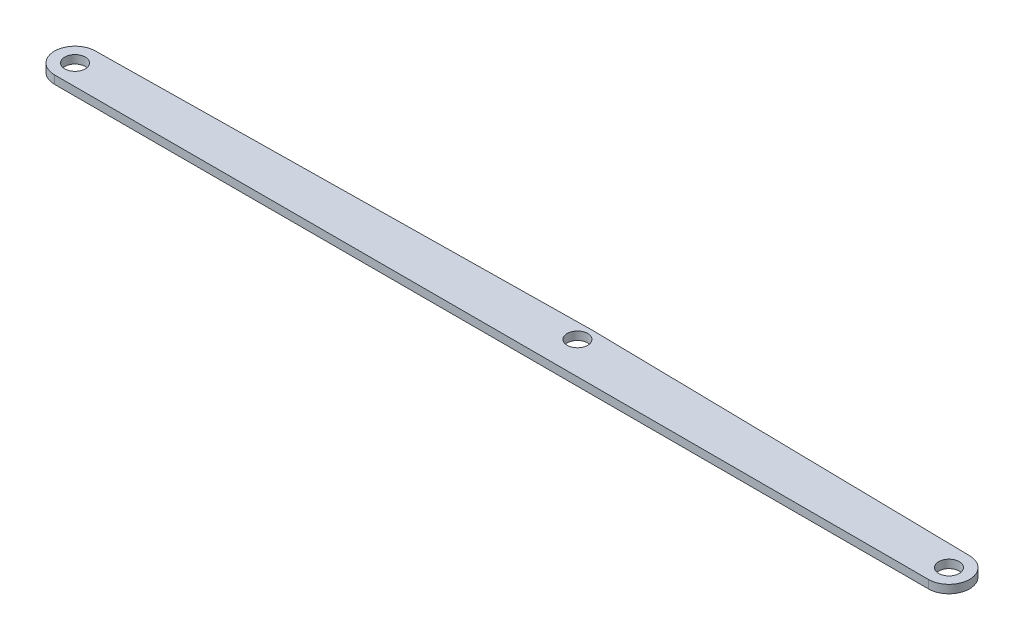
ISO-10303-21;
HEADER;
FILE_DESCRIPTION(('STEP AP214'),'2;1');
FILE_NAME('part.step','',(''),(''),'','','');
FILE_SCHEMA(('AUTOMOTIVE_DESIGN { 1 0 10303 214 1 1 1 1 }'));
ENDSEC;
DATA;
#1=APPLICATION_CONTEXT('core data for automotive mechanical design processes');
#2=APPLICATION_PROTOCOL_DEFINITION('international standard','automotive_design',2000,#1);
#3=PRODUCT_CONTEXT('',#1,'mechanical');
#4=PRODUCT('Part','Part','',(#3));
#5=PRODUCT_RELATED_PRODUCT_CATEGORY('part','',(#4));
#6=PRODUCT_DEFINITION_FORMATION('','',#4);
#7=PRODUCT_DEFINITION_CONTEXT('part definition',#1,'design');
#8=PRODUCT_DEFINITION('design','',#6,#7);
#9=PRODUCT_DEFINITION_SHAPE('','',#8);
#10=(LENGTH_UNIT() NAMED_UNIT(*) SI_UNIT(.MILLI.,.METRE.));
#11=(NAMED_UNIT(*) PLANE_ANGLE_UNIT() SI_UNIT($,.RADIAN.));
#12=(NAMED_UNIT(*) SI_UNIT($,.STERADIAN.) SOLID_ANGLE_UNIT());
#13=UNCERTAINTY_MEASURE_WITH_UNIT(LENGTH_MEASURE(1.E-05),#10,'distance_accuracy_value','');
#14=(GEOMETRIC_REPRESENTATION_CONTEXT(3) GLOBAL_UNCERTAINTY_ASSIGNED_CONTEXT((#13)) GLOBAL_UNIT_ASSIGNED_CONTEXT((#10,
#11,#12)) REPRESENTATION_CONTEXT('',''));
#15=CARTESIAN_POINT('',(0.,0.,0.));
#16=DIRECTION('',(0.,0.,1.));
#17=DIRECTION('',(1.,0.,0.));
#18=AXIS2_PLACEMENT_3D('',#15,#16,#17);
#19=CARTESIAN_POINT('',(0.,5.08,0.));
#20=DIRECTION('',(0.,-1.,0.));
#21=DIRECTION('',(0.,0.,-1.));
#22=AXIS2_PLACEMENT_3D('',#19,#20,#21);
#23=PLANE('',#22);
#24=CARTESIAN_POINT('',(0.,5.08,0.));
#25=DIRECTION('',(0.,1.,0.));
#26=DIRECTION('',(0.,0.,-1.));
#27=AXIS2_PLACEMENT_3D('',#24,#25,#26);
#28=CIRCLE('',#27,12.7);
#29=CARTESIAN_POINT('',(0.,5.08,12.7));
#30=VERTEX_POINT('',#29);
#31=CARTESIAN_POINT('',(0.,5.08,-12.7));
#32=VERTEX_POINT('',#31);
#33=EDGE_CURVE('E139',#30,#32,#28,.T.);
#34=ORIENTED_EDGE('',*,*,#33,.T.);
#35=DIRECTION('',(-0.999848752882836,0.,-0.017391703730135));
#36=VECTOR('',#35,1.);
#37=CARTESIAN_POINT('',(0.,5.08,-12.7));
#38=LINE('',#37,#36);
#39=CARTESIAN_POINT('',(-236.622080232382,5.08,-16.8158836309436));
#40=VERTEX_POINT('',#39);
#41=EDGE_CURVE('E97',#32,#40,#38,.T.);
#42=ORIENTED_EDGE('',*,*,#41,.T.);
#43=CARTESIAN_POINT('',(-236.787736210412,5.08,-7.29232425973456));
#44=DIRECTION('',(0.,1.,0.));
#45=DIRECTION('',(0.,0.,1.));
#46=AXIS2_PLACEMENT_3D('',#43,#44,#45);
#47=CIRCLE('',#46,9.525);
#48=CARTESIAN_POINT('',(-236.917177406981,5.08,-16.8164446903376));
#49=VERTEX_POINT('',#48);
#50=EDGE_CURVE('E110',#40,#49,#47,.T.);
#51=ORIENTED_EDGE('',*,*,#50,.T.);
#52=DIRECTION('',(-0.999907656756227,0.,0.0135896269363969));
#53=VECTOR('',#52,1.);
#54=CARTESIAN_POINT('',(-539.8,5.08,-12.7000000000001));
#55=LINE('',#54,#53);
#56=CARTESIAN_POINT('',(-539.8,5.08,-12.7000000000001));
#57=VERTEX_POINT('',#56);
#58=EDGE_CURVE('E104',#49,#57,#55,.T.);
#59=ORIENTED_EDGE('',*,*,#58,.T.);
#60=CARTESIAN_POINT('',(-539.8,5.08,0.));
#61=DIRECTION('',(0.,1.,0.));
#62=DIRECTION('',(0.,0.,-1.));
#63=AXIS2_PLACEMENT_3D('',#60,#61,#62);
#64=CIRCLE('',#63,12.7);
#65=CARTESIAN_POINT('',(-539.8,5.08,12.7));
#66=VERTEX_POINT('',#65);
#67=EDGE_CURVE('E108',#57,#66,#64,.T.);
#68=ORIENTED_EDGE('',*,*,#67,.T.);
#69=DIRECTION('',(1.,0.,0.));
#70=VECTOR('',#69,1.);
#71=CARTESIAN_POINT('',(-539.8,5.08,12.7));
#72=LINE('',#71,#70);
#73=EDGE_CURVE('E60',#66,#30,#72,.T.);
#74=ORIENTED_EDGE('',*,*,#73,.T.);
#75=EDGE_LOOP('',(#34,#42,#51,#59,#68,#74));
#76=FACE_BOUND('',#75,.T.);
#77=CARTESIAN_POINT('',(0.,5.08,0.));
#78=DIRECTION('',(0.,1.,0.));
#79=DIRECTION('',(0.,0.,1.));
#80=AXIS2_PLACEMENT_3D('',#77,#78,#79);
#81=CIRCLE('',#80,6.35);
#82=CARTESIAN_POINT('',(0.,5.08,6.35));
#83=VERTEX_POINT('',#82);
#84=EDGE_CURVE('E132',#83,#83,#81,.T.);
#85=ORIENTED_EDGE('',*,*,#84,.F.);
#86=EDGE_LOOP('',(#85));
#87=FACE_BOUND('',#86,.T.);
#88=CARTESIAN_POINT('',(-539.8,5.08,0.));
#89=DIRECTION('',(0.,1.,0.));
#90=DIRECTION('',(0.,0.,1.));
#91=AXIS2_PLACEMENT_3D('',#88,#89,#90);
#92=CIRCLE('',#91,6.34999999999994);
#93=CARTESIAN_POINT('',(-539.8,5.08,6.34999999999994));
#94=VERTEX_POINT('',#93);
#95=EDGE_CURVE('E193',#94,#94,#92,.T.);
#96=ORIENTED_EDGE('',*,*,#95,.F.);
#97=EDGE_LOOP('',(#96));
#98=FACE_BOUND('',#97,.T.);
#99=CARTESIAN_POINT('',(-236.787736210412,5.08,-7.29232425973456));
#100=DIRECTION('',(0.,1.,0.));
#101=DIRECTION('',(0.,0.,1.));
#102=AXIS2_PLACEMENT_3D('',#99,#100,#101);
#103=CIRCLE('',#102,6.35);
#104=CARTESIAN_POINT('',(-236.787736210412,5.08,-0.942324259734561));
#105=VERTEX_POINT('',#104);
#106=EDGE_CURVE('E184',#105,#105,#103,.T.);
#107=ORIENTED_EDGE('',*,*,#106,.F.);
#108=EDGE_LOOP('',(#107));
#109=FACE_BOUND('',#108,.T.);
#110=ADVANCED_FACE('F43',(#76,#87,#98,#109),#23,.F.);
#111=CARTESIAN_POINT('',(0.,0.,0.));
#112=DIRECTION('',(0.,-1.,0.));
#113=DIRECTION('',(0.,0.,-1.));
#114=AXIS2_PLACEMENT_3D('',#111,#112,#113);
#115=PLANE('',#114);
#116=CARTESIAN_POINT('',(-539.8,0.,0.));
#117=DIRECTION('',(0.,1.,0.));
#118=DIRECTION('',(0.,0.,1.));
#119=AXIS2_PLACEMENT_3D('',#116,#117,#118);
#120=CIRCLE('',#119,6.34999999999994);
#121=CARTESIAN_POINT('',(-539.8,0.,6.34999999999994));
#122=VERTEX_POINT('',#121);
#123=EDGE_CURVE('E190',#122,#122,#120,.T.);
#124=ORIENTED_EDGE('',*,*,#123,.T.);
#125=EDGE_LOOP('',(#124));
#126=FACE_BOUND('',#125,.T.);
#127=CARTESIAN_POINT('',(0.,0.,0.));
#128=DIRECTION('',(0.,1.,0.));
#129=DIRECTION('',(0.,0.,-1.));
#130=AXIS2_PLACEMENT_3D('',#127,#128,#129);
#131=CIRCLE('',#130,12.7);
#132=CARTESIAN_POINT('',(0.,0.,12.7));
#133=VERTEX_POINT('',#132);
#134=CARTESIAN_POINT('',(0.,0.,-12.7));
#135=VERTEX_POINT('',#134);
#136=EDGE_CURVE('E128',#133,#135,#131,.T.);
#137=ORIENTED_EDGE('',*,*,#136,.F.);
#138=DIRECTION('',(1.,0.,0.));
#139=VECTOR('',#138,1.);
#140=CARTESIAN_POINT('',(-539.8,0.,12.7));
#141=LINE('',#140,#139);
#142=CARTESIAN_POINT('',(-539.8,0.,12.7));
#143=VERTEX_POINT('',#142);
#144=EDGE_CURVE('E89',#143,#133,#141,.T.);
#145=ORIENTED_EDGE('',*,*,#144,.F.);
#146=CARTESIAN_POINT('',(-539.8,0.,0.));
#147=DIRECTION('',(0.,1.,0.));
#148=DIRECTION('',(0.,0.,-1.));
#149=AXIS2_PLACEMENT_3D('',#146,#147,#148);
#150=CIRCLE('',#149,12.7);
#151=CARTESIAN_POINT('',(-539.8,0.,-12.7000000000001));
#152=VERTEX_POINT('',#151);
#153=EDGE_CURVE('E83',#152,#143,#150,.T.);
#154=ORIENTED_EDGE('',*,*,#153,.F.);
#155=DIRECTION('',(-0.999907656756227,0.,0.0135896269363969));
#156=VECTOR('',#155,1.);
#157=CARTESIAN_POINT('',(-539.8,0.,-12.7000000000001));
#158=LINE('',#157,#156);
#159=CARTESIAN_POINT('',(-236.917177406981,0.,-16.8164446903376));
#160=VERTEX_POINT('',#159);
#161=EDGE_CURVE('E118',#160,#152,#158,.T.);
#162=ORIENTED_EDGE('',*,*,#161,.F.);
#163=CARTESIAN_POINT('',(-236.787736210412,0.,-7.29232425973456));
#164=DIRECTION('',(0.,1.,0.));
#165=DIRECTION('',(0.,0.,1.));
#166=AXIS2_PLACEMENT_3D('',#163,#164,#165);
#167=CIRCLE('',#166,9.525);
#168=CARTESIAN_POINT('',(-236.622080232382,0.,-16.8158836309436));
#169=VERTEX_POINT('',#168);
#170=EDGE_CURVE('E134',#169,#160,#167,.T.);
#171=ORIENTED_EDGE('',*,*,#170,.F.);
#172=DIRECTION('',(-0.999848752882836,0.,-0.017391703730135));
#173=VECTOR('',#172,1.);
#174=CARTESIAN_POINT('',(0.,0.,-12.7));
#175=LINE('',#174,#173);
#176=EDGE_CURVE('E131',#135,#169,#175,.T.);
#177=ORIENTED_EDGE('',*,*,#176,.F.);
#178=EDGE_LOOP('',(#137,#145,#154,#162,#171,#177));
#179=FACE_BOUND('',#178,.T.);
#180=CARTESIAN_POINT('',(0.,0.,0.));
#181=DIRECTION('',(0.,1.,0.));
#182=DIRECTION('',(0.,0.,1.));
#183=AXIS2_PLACEMENT_3D('',#180,#181,#182);
#184=CIRCLE('',#183,6.35);
#185=CARTESIAN_POINT('',(0.,0.,6.35));
#186=VERTEX_POINT('',#185);
#187=EDGE_CURVE('E196',#186,#186,#184,.T.);
#188=ORIENTED_EDGE('',*,*,#187,.T.);
#189=EDGE_LOOP('',(#188));
#190=FACE_BOUND('',#189,.T.);
#191=CARTESIAN_POINT('',(-236.787736210412,0.,-7.29232425973456));
#192=DIRECTION('',(0.,1.,0.));
#193=DIRECTION('',(0.,0.,1.));
#194=AXIS2_PLACEMENT_3D('',#191,#192,#193);
#195=CIRCLE('',#194,6.35);
#196=CARTESIAN_POINT('',(-236.787736210412,0.,-0.942324259734561));
#197=VERTEX_POINT('',#196);
#198=EDGE_CURVE('E187',#197,#197,#195,.T.);
#199=ORIENTED_EDGE('',*,*,#198,.T.);
#200=EDGE_LOOP('',(#199));
#201=FACE_BOUND('',#200,.T.);
#202=ADVANCED_FACE('F148',(#126,#179,#190,#201),#115,.T.);
#203=CARTESIAN_POINT('',(0.,5.08,0.));
#204=DIRECTION('',(0.,-1.,0.));
#205=DIRECTION('',(0.,0.,-1.));
#206=AXIS2_PLACEMENT_3D('',#203,#204,#205);
#207=CYLINDRICAL_SURFACE('',#206,12.7);
#208=ORIENTED_EDGE('',*,*,#136,.T.);
#209=DIRECTION('',(0.,-1.,0.));
#210=VECTOR('',#209,1.);
#211=CARTESIAN_POINT('',(0.,5.08,-12.7));
#212=LINE('',#211,#210);
#213=EDGE_CURVE('E11',#32,#135,#212,.T.);
#214=ORIENTED_EDGE('',*,*,#213,.F.);
#215=ORIENTED_EDGE('',*,*,#33,.F.);
#216=DIRECTION('',(0.,-1.,0.));
#217=VECTOR('',#216,1.);
#218=CARTESIAN_POINT('',(0.,5.08,12.7));
#219=LINE('',#218,#217);
#220=EDGE_CURVE('E124',#30,#133,#219,.T.);
#221=ORIENTED_EDGE('',*,*,#220,.T.);
#222=EDGE_LOOP('',(#208,#214,#215,#221));
#223=FACE_BOUND('',#222,.T.);
#224=ADVANCED_FACE('F45',(#223),#207,.T.);
#225=CARTESIAN_POINT('',(0.,5.08,-12.7));
#226=DIRECTION('',(-0.017391703730135,0.,0.999848752882836));
#227=DIRECTION('',(0.999848752882836,0.,0.017391703730135));
#228=AXIS2_PLACEMENT_3D('',#225,#226,#227);
#229=PLANE('',#228);
#230=ORIENTED_EDGE('',*,*,#176,.T.);
#231=DIRECTION('',(0.,-1.,0.));
#232=VECTOR('',#231,1.);
#233=CARTESIAN_POINT('',(-236.622080232382,5.08,-16.8158836309436));
#234=LINE('',#233,#232);
#235=EDGE_CURVE('E52',#40,#169,#234,.T.);
#236=ORIENTED_EDGE('',*,*,#235,.F.);
#237=ORIENTED_EDGE('',*,*,#41,.F.);
#238=ORIENTED_EDGE('',*,*,#213,.T.);
#239=EDGE_LOOP('',(#230,#236,#237,#238));
#240=FACE_BOUND('',#239,.T.);
#241=ADVANCED_FACE('F250',(#240),#229,.F.);
#242=CARTESIAN_POINT('',(-236.787736210412,5.08,-7.29232425973456));
#243=DIRECTION('',(0.,-1.,0.));
#244=DIRECTION('',(0.,0.,-1.));
#245=AXIS2_PLACEMENT_3D('',#242,#243,#244);
#246=CYLINDRICAL_SURFACE('',#245,9.525);
#247=ORIENTED_EDGE('',*,*,#170,.T.);
#248=DIRECTION('',(0.,-1.,0.));
#249=VECTOR('',#248,1.);
#250=CARTESIAN_POINT('',(-236.917177406981,5.08,-16.8164446903376));
#251=LINE('',#250,#249);
#252=EDGE_CURVE('E119',#49,#160,#251,.T.);
#253=ORIENTED_EDGE('',*,*,#252,.F.);
#254=ORIENTED_EDGE('',*,*,#50,.F.);
#255=ORIENTED_EDGE('',*,*,#235,.T.);
#256=EDGE_LOOP('',(#247,#253,#254,#255));
#257=FACE_BOUND('',#256,.T.);
#258=ADVANCED_FACE('F145',(#257),#246,.T.);
#259=CARTESIAN_POINT('',(-539.8,5.08,-12.7000000000001));
#260=DIRECTION('',(0.0135896269363969,0.,0.999907656756227));
#261=DIRECTION('',(0.999907656756228,0.,-0.0135896269363969));
#262=AXIS2_PLACEMENT_3D('',#259,#260,#261);
#263=PLANE('',#262);
#264=ORIENTED_EDGE('',*,*,#161,.T.);
#265=DIRECTION('',(0.,-1.,0.));
#266=VECTOR('',#265,1.);
#267=CARTESIAN_POINT('',(-539.8,5.08,-12.7000000000001));
#268=LINE('',#267,#266);
#269=EDGE_CURVE('E115',#57,#152,#268,.T.);
#270=ORIENTED_EDGE('',*,*,#269,.F.);
#271=ORIENTED_EDGE('',*,*,#58,.F.);
#272=ORIENTED_EDGE('',*,*,#252,.T.);
#273=EDGE_LOOP('',(#264,#270,#271,#272));
#274=FACE_BOUND('',#273,.T.);
#275=ADVANCED_FACE('F116',(#274),#263,.F.);
#276=CARTESIAN_POINT('',(-539.8,5.08,0.));
#277=DIRECTION('',(0.,-1.,0.));
#278=DIRECTION('',(0.,0.,-1.));
#279=AXIS2_PLACEMENT_3D('',#276,#277,#278);
#280=CYLINDRICAL_SURFACE('',#279,12.7);
#281=ORIENTED_EDGE('',*,*,#153,.T.);
#282=DIRECTION('',(0.,-1.,0.));
#283=VECTOR('',#282,1.);
#284=CARTESIAN_POINT('',(-539.8,5.08,12.7));
#285=LINE('',#284,#283);
#286=EDGE_CURVE('E120',#66,#143,#285,.T.);
#287=ORIENTED_EDGE('',*,*,#286,.F.);
#288=ORIENTED_EDGE('',*,*,#67,.F.);
#289=ORIENTED_EDGE('',*,*,#269,.T.);
#290=EDGE_LOOP('',(#281,#287,#288,#289));
#291=FACE_BOUND('',#290,.T.);
#292=ADVANCED_FACE('F122',(#291),#280,.T.);
#293=CARTESIAN_POINT('',(-539.8,5.08,12.7));
#294=DIRECTION('',(0.,0.,-1.));
#295=DIRECTION('',(-1.,0.,0.));
#296=AXIS2_PLACEMENT_3D('',#293,#294,#295);
#297=PLANE('',#296);
#298=ORIENTED_EDGE('',*,*,#144,.T.);
#299=ORIENTED_EDGE('',*,*,#220,.F.);
#300=ORIENTED_EDGE('',*,*,#73,.F.);
#301=ORIENTED_EDGE('',*,*,#286,.T.);
#302=EDGE_LOOP('',(#298,#299,#300,#301));
#303=FACE_BOUND('',#302,.T.);
#304=ADVANCED_FACE('F153',(#303),#297,.F.);
#305=CARTESIAN_POINT('',(0.,5.08,0.));
#306=DIRECTION('',(0.,-1.,0.));
#307=DIRECTION('',(0.,0.,-1.));
#308=AXIS2_PLACEMENT_3D('',#305,#306,#307);
#309=CYLINDRICAL_SURFACE('',#308,6.35);
#310=ORIENTED_EDGE('',*,*,#84,.T.);
#311=EDGE_LOOP('',(#310));
#312=FACE_BOUND('',#311,.T.);
#313=ORIENTED_EDGE('',*,*,#187,.F.);
#314=EDGE_LOOP('',(#313));
#315=FACE_BOUND('',#314,.T.);
#316=ADVANCED_FACE('F155',(#312,#315),#309,.F.);
#317=CARTESIAN_POINT('',(-539.8,5.08,0.));
#318=DIRECTION('',(0.,-1.,0.));
#319=DIRECTION('',(0.,0.,-1.));
#320=AXIS2_PLACEMENT_3D('',#317,#318,#319);
#321=CYLINDRICAL_SURFACE('',#320,6.34999999999994);
#322=ORIENTED_EDGE('',*,*,#95,.T.);
#323=EDGE_LOOP('',(#322));
#324=FACE_BOUND('',#323,.T.);
#325=ORIENTED_EDGE('',*,*,#123,.F.);
#326=EDGE_LOOP('',(#325));
#327=FACE_BOUND('',#326,.T.);
#328=ADVANCED_FACE('F161',(#324,#327),#321,.F.);
#329=CARTESIAN_POINT('',(-236.787736210412,5.08,-7.29232425973456));
#330=DIRECTION('',(0.,-1.,0.));
#331=DIRECTION('',(0.,0.,-1.));
#332=AXIS2_PLACEMENT_3D('',#329,#330,#331);
#333=CYLINDRICAL_SURFACE('',#332,6.35);
#334=ORIENTED_EDGE('',*,*,#106,.T.);
#335=EDGE_LOOP('',(#334));
#336=FACE_BOUND('',#335,.T.);
#337=ORIENTED_EDGE('',*,*,#198,.F.);
#338=EDGE_LOOP('',(#337));
#339=FACE_BOUND('',#338,.T.);
#340=ADVANCED_FACE('F175',(#336,#339),#333,.F.);
#341=CLOSED_SHELL('',(#110,#202,#224,#241,#258,#275,#292,#304,#316,#328,#340));
#342=MANIFOLD_SOLID_BREP('B2',#341);
#343=ADVANCED_BREP_SHAPE_REPRESENTATION('',(#18,#342),#14);
#344=SHAPE_DEFINITION_REPRESENTATION(#9,#343);
ENDSEC;
END-ISO-10303-21;
